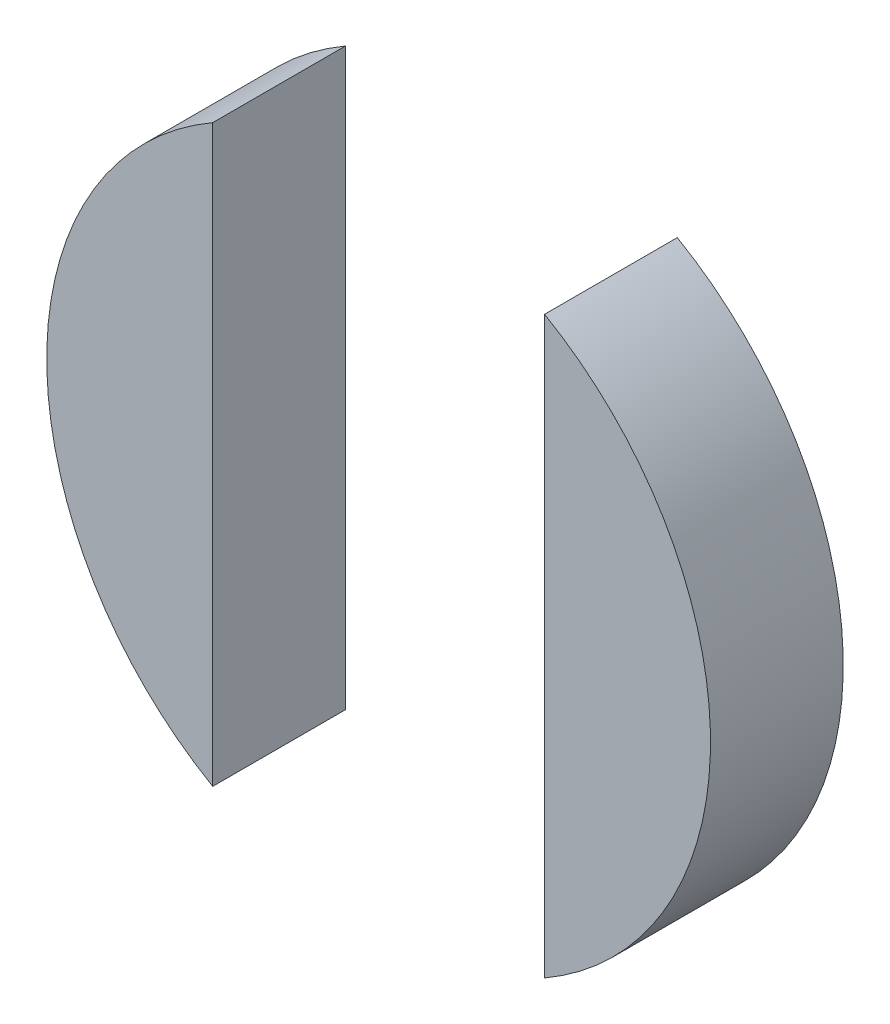
ISO-10303-21;
HEADER;
FILE_DESCRIPTION(('STEP AP214'),'2;1');
FILE_NAME('part.step','',(''),(''),'','','');
FILE_SCHEMA(('AUTOMOTIVE_DESIGN { 1 0 10303 214 1 1 1 1 }'));
ENDSEC;
DATA;
#1=APPLICATION_CONTEXT('core data for automotive mechanical design processes');
#2=APPLICATION_PROTOCOL_DEFINITION('international standard','automotive_design',2000,#1);
#3=PRODUCT_CONTEXT('',#1,'mechanical');
#4=PRODUCT('Part','Part','',(#3));
#5=PRODUCT_RELATED_PRODUCT_CATEGORY('part','',(#4));
#6=PRODUCT_DEFINITION_FORMATION('','',#4);
#7=PRODUCT_DEFINITION_CONTEXT('part definition',#1,'design');
#8=PRODUCT_DEFINITION('design','',#6,#7);
#9=PRODUCT_DEFINITION_SHAPE('','',#8);
#10=(LENGTH_UNIT() NAMED_UNIT(*) SI_UNIT(.MILLI.,.METRE.));
#11=(NAMED_UNIT(*) PLANE_ANGLE_UNIT() SI_UNIT($,.RADIAN.));
#12=(NAMED_UNIT(*) SI_UNIT($,.STERADIAN.) SOLID_ANGLE_UNIT());
#13=UNCERTAINTY_MEASURE_WITH_UNIT(LENGTH_MEASURE(1.E-05),#10,'distance_accuracy_value','');
#14=(GEOMETRIC_REPRESENTATION_CONTEXT(3) GLOBAL_UNCERTAINTY_ASSIGNED_CONTEXT((#13)) GLOBAL_UNIT_ASSIGNED_CONTEXT((#10,
#11,#12)) REPRESENTATION_CONTEXT('',''));
#15=CARTESIAN_POINT('',(0.,0.,0.));
#16=DIRECTION('',(0.,0.,1.));
#17=DIRECTION('',(1.,0.,0.));
#18=AXIS2_PLACEMENT_3D('',#15,#16,#17);
#19=CARTESIAN_POINT('',(0.,0.,4.));
#20=DIRECTION('',(0.,0.,-1.));
#21=DIRECTION('',(-1.,0.,0.));
#22=AXIS2_PLACEMENT_3D('',#19,#20,#21);
#23=CYLINDRICAL_SURFACE('',#22,10.);
#24=CARTESIAN_POINT('',(0.,0.,0.));
#25=DIRECTION('',(0.,0.,1.));
#26=DIRECTION('',(-1.,0.,0.));
#27=AXIS2_PLACEMENT_3D('',#24,#25,#26);
#28=CIRCLE('',#27,10.);
#29=CARTESIAN_POINT('',(5.,-8.66025403784439,0.));
#30=VERTEX_POINT('',#29);
#31=CARTESIAN_POINT('',(5.,8.66025403784439,0.));
#32=VERTEX_POINT('',#31);
#33=EDGE_CURVE('E74',#30,#32,#28,.T.);
#34=ORIENTED_EDGE('',*,*,#33,.T.);
#35=DIRECTION('',(0.,0.,-1.));
#36=VECTOR('',#35,1.);
#37=CARTESIAN_POINT('',(5.,8.66025403784439,4.));
#38=LINE('',#37,#36);
#39=CARTESIAN_POINT('',(5.,8.66025403784439,4.));
#40=VERTEX_POINT('',#39);
#41=EDGE_CURVE('E12',#40,#32,#38,.T.);
#42=ORIENTED_EDGE('',*,*,#41,.F.);
#43=CARTESIAN_POINT('',(0.,0.,4.));
#44=DIRECTION('',(0.,0.,1.));
#45=DIRECTION('',(-1.,0.,0.));
#46=AXIS2_PLACEMENT_3D('',#43,#44,#45);
#47=CIRCLE('',#46,10.);
#48=CARTESIAN_POINT('',(5.,-8.66025403784439,4.));
#49=VERTEX_POINT('',#48);
#50=EDGE_CURVE('E73',#49,#40,#47,.T.);
#51=ORIENTED_EDGE('',*,*,#50,.F.);
#52=DIRECTION('',(0.,0.,-1.));
#53=VECTOR('',#52,1.);
#54=CARTESIAN_POINT('',(5.,-8.66025403784439,4.));
#55=LINE('',#54,#53);
#56=EDGE_CURVE('E51',#49,#30,#55,.T.);
#57=ORIENTED_EDGE('',*,*,#56,.T.);
#58=EDGE_LOOP('',(#34,#42,#51,#57));
#59=FACE_BOUND('',#58,.T.);
#60=ADVANCED_FACE('F43',(#59),#23,.T.);
#61=CARTESIAN_POINT('',(5.,8.66025403784439,4.));
#62=DIRECTION('',(1.,0.,0.));
#63=DIRECTION('',(0.,0.,-1.));
#64=AXIS2_PLACEMENT_3D('',#61,#62,#63);
#65=PLANE('',#64);
#66=DIRECTION('',(0.,-1.,0.));
#67=VECTOR('',#66,1.);
#68=CARTESIAN_POINT('',(5.,8.66025403784439,0.));
#69=LINE('',#68,#67);
#70=EDGE_CURVE('E66',#32,#30,#69,.T.);
#71=ORIENTED_EDGE('',*,*,#70,.T.);
#72=ORIENTED_EDGE('',*,*,#56,.F.);
#73=DIRECTION('',(0.,-1.,0.));
#74=VECTOR('',#73,1.);
#75=CARTESIAN_POINT('',(5.,8.66025403784439,4.));
#76=LINE('',#75,#74);
#77=EDGE_CURVE('E58',#40,#49,#76,.T.);
#78=ORIENTED_EDGE('',*,*,#77,.F.);
#79=ORIENTED_EDGE('',*,*,#41,.T.);
#80=EDGE_LOOP('',(#71,#72,#78,#79));
#81=FACE_BOUND('',#80,.T.);
#82=ADVANCED_FACE('F69',(#81),#65,.F.);
#83=CARTESIAN_POINT('',(0.,0.,4.));
#84=DIRECTION('',(0.,0.,-1.));
#85=DIRECTION('',(-1.,0.,0.));
#86=AXIS2_PLACEMENT_3D('',#83,#84,#85);
#87=PLANE('',#86);
#88=ORIENTED_EDGE('',*,*,#50,.T.);
#89=ORIENTED_EDGE('',*,*,#77,.T.);
#90=EDGE_LOOP('',(#88,#89));
#91=FACE_BOUND('',#90,.T.);
#92=ADVANCED_FACE('F81',(#91),#87,.F.);
#93=CARTESIAN_POINT('',(0.,0.,0.));
#94=DIRECTION('',(0.,0.,-1.));
#95=DIRECTION('',(-1.,0.,0.));
#96=AXIS2_PLACEMENT_3D('',#93,#94,#95);
#97=PLANE('',#96);
#98=ORIENTED_EDGE('',*,*,#33,.F.);
#99=ORIENTED_EDGE('',*,*,#70,.F.);
#100=EDGE_LOOP('',(#98,#99));
#101=FACE_BOUND('',#100,.T.);
#102=ADVANCED_FACE('F77',(#101),#97,.T.);
#103=CLOSED_SHELL('',(#60,#82,#92,#102));
#104=MANIFOLD_SOLID_BREP('B2',#103);
#105=CARTESIAN_POINT('',(0.,0.,4.));
#106=DIRECTION('',(0.,0.,-1.));
#107=DIRECTION('',(-1.,0.,0.));
#108=AXIS2_PLACEMENT_3D('',#105,#106,#107);
#109=CYLINDRICAL_SURFACE('',#108,10.);
#110=CARTESIAN_POINT('',(0.,0.,0.));
#111=DIRECTION('',(0.,0.,1.));
#112=DIRECTION('',(1.,0.,0.));
#113=AXIS2_PLACEMENT_3D('',#110,#111,#112);
#114=CIRCLE('',#113,10.);
#115=CARTESIAN_POINT('',(-5.,8.66025403784439,0.));
#116=VERTEX_POINT('',#115);
#117=CARTESIAN_POINT('',(-5.,-8.66025403784439,0.));
#118=VERTEX_POINT('',#117);
#119=EDGE_CURVE('E146',#116,#118,#114,.T.);
#120=ORIENTED_EDGE('',*,*,#119,.T.);
#121=DIRECTION('',(0.,0.,-1.));
#122=VECTOR('',#121,1.);
#123=CARTESIAN_POINT('',(-5.,-8.66025403784439,4.));
#124=LINE('',#123,#122);
#125=CARTESIAN_POINT('',(-5.,-8.66025403784439,4.));
#126=VERTEX_POINT('',#125);
#127=EDGE_CURVE('E41',#126,#118,#124,.T.);
#128=ORIENTED_EDGE('',*,*,#127,.F.);
#129=CARTESIAN_POINT('',(0.,0.,4.));
#130=DIRECTION('',(0.,0.,1.));
#131=DIRECTION('',(1.,0.,0.));
#132=AXIS2_PLACEMENT_3D('',#129,#130,#131);
#133=CIRCLE('',#132,10.);
#134=CARTESIAN_POINT('',(-5.,8.66025403784439,4.));
#135=VERTEX_POINT('',#134);
#136=EDGE_CURVE('E145',#135,#126,#133,.T.);
#137=ORIENTED_EDGE('',*,*,#136,.F.);
#138=DIRECTION('',(0.,0.,-1.));
#139=VECTOR('',#138,1.);
#140=CARTESIAN_POINT('',(-5.,8.66025403784439,4.));
#141=LINE('',#140,#139);
#142=EDGE_CURVE('E123',#135,#116,#141,.T.);
#143=ORIENTED_EDGE('',*,*,#142,.T.);
#144=EDGE_LOOP('',(#120,#128,#137,#143));
#145=FACE_BOUND('',#144,.T.);
#146=ADVANCED_FACE('F115',(#145),#109,.T.);
#147=CARTESIAN_POINT('',(-5.,8.66025403784439,4.));
#148=DIRECTION('',(-1.,0.,0.));
#149=DIRECTION('',(0.,0.,1.));
#150=AXIS2_PLACEMENT_3D('',#147,#148,#149);
#151=PLANE('',#150);
#152=DIRECTION('',(0.,1.,0.));
#153=VECTOR('',#152,1.);
#154=CARTESIAN_POINT('',(-5.,8.66025403784439,0.));
#155=LINE('',#154,#153);
#156=EDGE_CURVE('E138',#118,#116,#155,.T.);
#157=ORIENTED_EDGE('',*,*,#156,.T.);
#158=ORIENTED_EDGE('',*,*,#142,.F.);
#159=DIRECTION('',(0.,1.,0.));
#160=VECTOR('',#159,1.);
#161=CARTESIAN_POINT('',(-5.,8.66025403784439,4.));
#162=LINE('',#161,#160);
#163=EDGE_CURVE('E130',#126,#135,#162,.T.);
#164=ORIENTED_EDGE('',*,*,#163,.F.);
#165=ORIENTED_EDGE('',*,*,#127,.T.);
#166=EDGE_LOOP('',(#157,#158,#164,#165));
#167=FACE_BOUND('',#166,.T.);
#168=ADVANCED_FACE('F141',(#167),#151,.F.);
#169=CARTESIAN_POINT('',(0.,0.,4.));
#170=DIRECTION('',(0.,0.,1.));
#171=DIRECTION('',(1.,0.,0.));
#172=AXIS2_PLACEMENT_3D('',#169,#170,#171);
#173=PLANE('',#172);
#174=ORIENTED_EDGE('',*,*,#136,.T.);
#175=ORIENTED_EDGE('',*,*,#163,.T.);
#176=EDGE_LOOP('',(#174,#175));
#177=FACE_BOUND('',#176,.T.);
#178=ADVANCED_FACE('F153',(#177),#173,.T.);
#179=CARTESIAN_POINT('',(0.,0.,0.));
#180=DIRECTION('',(0.,0.,1.));
#181=DIRECTION('',(1.,0.,0.));
#182=AXIS2_PLACEMENT_3D('',#179,#180,#181);
#183=PLANE('',#182);
#184=ORIENTED_EDGE('',*,*,#119,.F.);
#185=ORIENTED_EDGE('',*,*,#156,.F.);
#186=EDGE_LOOP('',(#184,#185));
#187=FACE_BOUND('',#186,.T.);
#188=ADVANCED_FACE('F149',(#187),#183,.F.);
#189=CLOSED_SHELL('',(#146,#168,#178,#188));
#190=MANIFOLD_SOLID_BREP('B6',#189);
#191=ADVANCED_BREP_SHAPE_REPRESENTATION('',(#18,#104,#190),#14);
#192=SHAPE_DEFINITION_REPRESENTATION(#9,#191);
ENDSEC;
END-ISO-10303-21;
